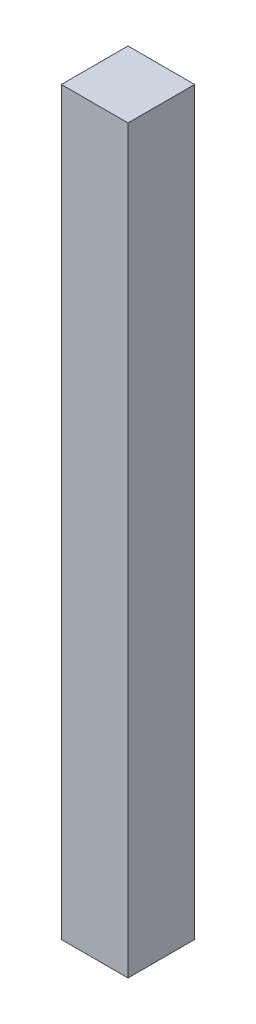
ISO-10303-21;
HEADER;
FILE_DESCRIPTION(('STEP AP214'),'2;1');
FILE_NAME('part.step','',(''),(''),'','','');
FILE_SCHEMA(('AUTOMOTIVE_DESIGN { 1 0 10303 214 1 1 1 1 }'));
ENDSEC;
DATA;
#1=APPLICATION_CONTEXT('core data for automotive mechanical design processes');
#2=APPLICATION_PROTOCOL_DEFINITION('international standard','automotive_design',2000,#1);
#3=PRODUCT_CONTEXT('',#1,'mechanical');
#4=PRODUCT('Part','Part','',(#3));
#5=PRODUCT_RELATED_PRODUCT_CATEGORY('part','',(#4));
#6=PRODUCT_DEFINITION_FORMATION('','',#4);
#7=PRODUCT_DEFINITION_CONTEXT('part definition',#1,'design');
#8=PRODUCT_DEFINITION('design','',#6,#7);
#9=PRODUCT_DEFINITION_SHAPE('','',#8);
#10=(LENGTH_UNIT() NAMED_UNIT(*) SI_UNIT(.MILLI.,.METRE.));
#11=(NAMED_UNIT(*) PLANE_ANGLE_UNIT() SI_UNIT($,.RADIAN.));
#12=(NAMED_UNIT(*) SI_UNIT($,.STERADIAN.) SOLID_ANGLE_UNIT());
#13=UNCERTAINTY_MEASURE_WITH_UNIT(LENGTH_MEASURE(1.E-05),#10,'distance_accuracy_value','');
#14=(GEOMETRIC_REPRESENTATION_CONTEXT(3) GLOBAL_UNCERTAINTY_ASSIGNED_CONTEXT((#13)) GLOBAL_UNIT_ASSIGNED_CONTEXT((#10,
#11,#12)) REPRESENTATION_CONTEXT('',''));
#15=CARTESIAN_POINT('',(0.,0.,0.));
#16=DIRECTION('',(0.,0.,1.));
#17=DIRECTION('',(1.,0.,0.));
#18=AXIS2_PLACEMENT_3D('',#15,#16,#17);
#19=CARTESIAN_POINT('',(45.,1590.,26.));
#20=DIRECTION('',(1.,0.,0.));
#21=DIRECTION('',(0.,0.,-1.));
#22=AXIS2_PLACEMENT_3D('',#19,#20,#21);
#23=PLANE('',#22);
#24=DIRECTION('',(0.,-1.,0.));
#25=VECTOR('',#24,1.);
#26=CARTESIAN_POINT('',(45.,1590.,8.));
#27=LINE('',#26,#25);
#28=CARTESIAN_POINT('',(45.,1790.,8.));
#29=VERTEX_POINT('',#28);
#30=CARTESIAN_POINT('',(45.,1590.,8.));
#31=VERTEX_POINT('',#30);
#32=EDGE_CURVE('E102',#29,#31,#27,.T.);
#33=ORIENTED_EDGE('',*,*,#32,.T.);
#34=DIRECTION('',(0.,0.,-1.));
#35=VECTOR('',#34,1.);
#36=CARTESIAN_POINT('',(45.,1590.,26.));
#37=LINE('',#36,#35);
#38=CARTESIAN_POINT('',(45.,1590.,26.));
#39=VERTEX_POINT('',#38);
#40=EDGE_CURVE('E11',#39,#31,#37,.T.);
#41=ORIENTED_EDGE('',*,*,#40,.F.);
#42=DIRECTION('',(0.,-1.,0.));
#43=VECTOR('',#42,1.);
#44=CARTESIAN_POINT('',(45.,1590.,26.));
#45=LINE('',#44,#43);
#46=CARTESIAN_POINT('',(45.,1790.,26.));
#47=VERTEX_POINT('',#46);
#48=EDGE_CURVE('E90',#47,#39,#45,.T.);
#49=ORIENTED_EDGE('',*,*,#48,.F.);
#50=DIRECTION('',(0.,0.,-1.));
#51=VECTOR('',#50,1.);
#52=CARTESIAN_POINT('',(45.,1790.,26.));
#53=LINE('',#52,#51);
#54=EDGE_CURVE('E98',#47,#29,#53,.T.);
#55=ORIENTED_EDGE('',*,*,#54,.T.);
#56=EDGE_LOOP('',(#33,#41,#49,#55));
#57=FACE_BOUND('',#56,.T.);
#58=ADVANCED_FACE('F39',(#57),#23,.F.);
#59=CARTESIAN_POINT('',(45.,1590.,26.));
#60=DIRECTION('',(0.,1.,0.));
#61=DIRECTION('',(0.,0.,1.));
#62=AXIS2_PLACEMENT_3D('',#59,#60,#61);
#63=PLANE('',#62);
#64=DIRECTION('',(1.,0.,0.));
#65=VECTOR('',#64,1.);
#66=CARTESIAN_POINT('',(45.,1590.,8.));
#67=LINE('',#66,#65);
#68=CARTESIAN_POINT('',(63.,1590.,8.));
#69=VERTEX_POINT('',#68);
#70=EDGE_CURVE('E94',#31,#69,#67,.T.);
#71=ORIENTED_EDGE('',*,*,#70,.T.);
#72=DIRECTION('',(0.,0.,-1.));
#73=VECTOR('',#72,1.);
#74=CARTESIAN_POINT('',(63.,1590.,26.));
#75=LINE('',#74,#73);
#76=CARTESIAN_POINT('',(63.,1590.,26.));
#77=VERTEX_POINT('',#76);
#78=EDGE_CURVE('E47',#77,#69,#75,.T.);
#79=ORIENTED_EDGE('',*,*,#78,.F.);
#80=DIRECTION('',(1.,0.,0.));
#81=VECTOR('',#80,1.);
#82=CARTESIAN_POINT('',(45.,1590.,26.));
#83=LINE('',#82,#81);
#84=EDGE_CURVE('E85',#39,#77,#83,.T.);
#85=ORIENTED_EDGE('',*,*,#84,.F.);
#86=ORIENTED_EDGE('',*,*,#40,.T.);
#87=EDGE_LOOP('',(#71,#79,#85,#86));
#88=FACE_BOUND('',#87,.T.);
#89=ADVANCED_FACE('F93',(#88),#63,.F.);
#90=CARTESIAN_POINT('',(63.,1590.,26.));
#91=DIRECTION('',(-1.,0.,0.));
#92=DIRECTION('',(0.,0.,1.));
#93=AXIS2_PLACEMENT_3D('',#90,#91,#92);
#94=PLANE('',#93);
#95=DIRECTION('',(0.,1.,0.));
#96=VECTOR('',#95,1.);
#97=CARTESIAN_POINT('',(63.,1590.,8.));
#98=LINE('',#97,#96);
#99=CARTESIAN_POINT('',(63.,1790.,8.));
#100=VERTEX_POINT('',#99);
#101=EDGE_CURVE('E72',#69,#100,#98,.T.);
#102=ORIENTED_EDGE('',*,*,#101,.T.);
#103=DIRECTION('',(0.,0.,-1.));
#104=VECTOR('',#103,1.);
#105=CARTESIAN_POINT('',(63.,1790.,26.));
#106=LINE('',#105,#104);
#107=CARTESIAN_POINT('',(63.,1790.,26.));
#108=VERTEX_POINT('',#107);
#109=EDGE_CURVE('E95',#108,#100,#106,.T.);
#110=ORIENTED_EDGE('',*,*,#109,.F.);
#111=DIRECTION('',(0.,1.,0.));
#112=VECTOR('',#111,1.);
#113=CARTESIAN_POINT('',(63.,1590.,26.));
#114=LINE('',#113,#112);
#115=EDGE_CURVE('E88',#77,#108,#114,.T.);
#116=ORIENTED_EDGE('',*,*,#115,.F.);
#117=ORIENTED_EDGE('',*,*,#78,.T.);
#118=EDGE_LOOP('',(#102,#110,#116,#117));
#119=FACE_BOUND('',#118,.T.);
#120=ADVANCED_FACE('F96',(#119),#94,.F.);
#121=CARTESIAN_POINT('',(45.,1790.,26.));
#122=DIRECTION('',(0.,-1.,0.));
#123=DIRECTION('',(0.,0.,-1.));
#124=AXIS2_PLACEMENT_3D('',#121,#122,#123);
#125=PLANE('',#124);
#126=DIRECTION('',(-1.,0.,0.));
#127=VECTOR('',#126,1.);
#128=CARTESIAN_POINT('',(45.,1790.,8.));
#129=LINE('',#128,#127);
#130=EDGE_CURVE('E78',#100,#29,#129,.T.);
#131=ORIENTED_EDGE('',*,*,#130,.T.);
#132=ORIENTED_EDGE('',*,*,#54,.F.);
#133=DIRECTION('',(-1.,0.,0.));
#134=VECTOR('',#133,1.);
#135=CARTESIAN_POINT('',(45.,1790.,26.));
#136=LINE('',#135,#134);
#137=EDGE_CURVE('E55',#108,#47,#136,.T.);
#138=ORIENTED_EDGE('',*,*,#137,.F.);
#139=ORIENTED_EDGE('',*,*,#109,.T.);
#140=EDGE_LOOP('',(#131,#132,#138,#139));
#141=FACE_BOUND('',#140,.T.);
#142=ADVANCED_FACE('F109',(#141),#125,.F.);
#143=CARTESIAN_POINT('',(0.,0.,26.));
#144=DIRECTION('',(0.,0.,-1.));
#145=DIRECTION('',(-1.,0.,0.));
#146=AXIS2_PLACEMENT_3D('',#143,#144,#145);
#147=PLANE('',#146);
#148=ORIENTED_EDGE('',*,*,#48,.T.);
#149=ORIENTED_EDGE('',*,*,#84,.T.);
#150=ORIENTED_EDGE('',*,*,#115,.T.);
#151=ORIENTED_EDGE('',*,*,#137,.T.);
#152=EDGE_LOOP('',(#148,#149,#150,#151));
#153=FACE_BOUND('',#152,.T.);
#154=ADVANCED_FACE('F86',(#153),#147,.F.);
#155=CARTESIAN_POINT('',(0.,0.,8.));
#156=DIRECTION('',(0.,0.,-1.));
#157=DIRECTION('',(-1.,0.,0.));
#158=AXIS2_PLACEMENT_3D('',#155,#156,#157);
#159=PLANE('',#158);
#160=ORIENTED_EDGE('',*,*,#32,.F.);
#161=ORIENTED_EDGE('',*,*,#130,.F.);
#162=ORIENTED_EDGE('',*,*,#101,.F.);
#163=ORIENTED_EDGE('',*,*,#70,.F.);
#164=EDGE_LOOP('',(#160,#161,#162,#163));
#165=FACE_BOUND('',#164,.T.);
#166=ADVANCED_FACE('F112',(#165),#159,.T.);
#167=CLOSED_SHELL('',(#58,#89,#120,#142,#154,#166));
#168=MANIFOLD_SOLID_BREP('B2',#167);
#169=ADVANCED_BREP_SHAPE_REPRESENTATION('',(#18,#168),#14);
#170=SHAPE_DEFINITION_REPRESENTATION(#9,#169);
ENDSEC;
END-ISO-10303-21;
